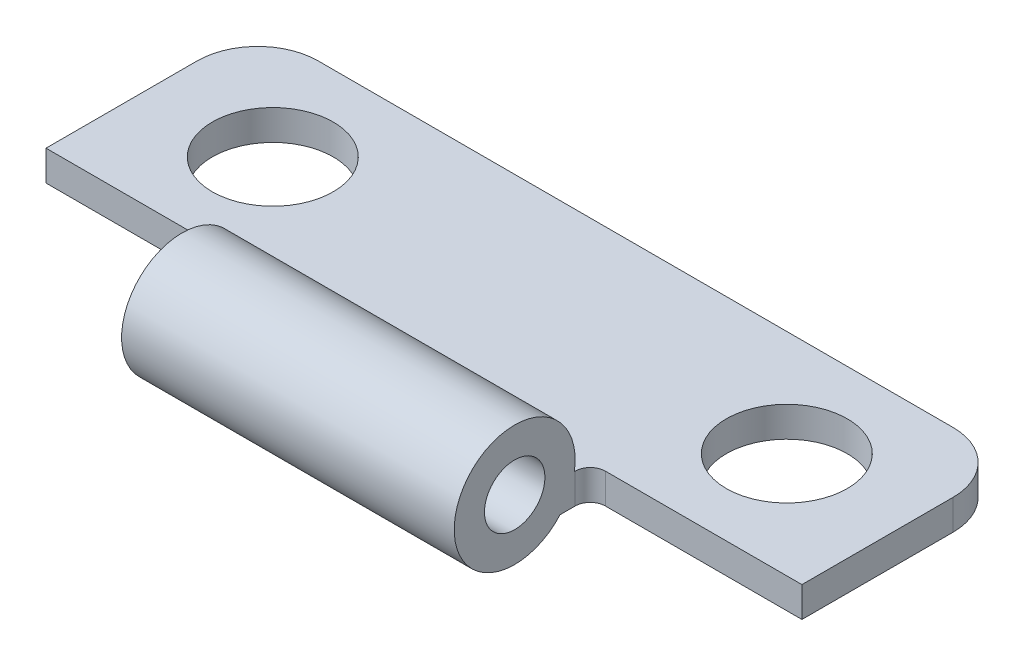
ISO-10303-21;
HEADER;
FILE_DESCRIPTION(('STEP AP214'),'2;1');
FILE_NAME('part.step','',(''),(''),'','','');
FILE_SCHEMA(('AUTOMOTIVE_DESIGN { 1 0 10303 214 1 1 1 1 }'));
ENDSEC;
DATA;
#1=APPLICATION_CONTEXT('core data for automotive mechanical design processes');
#2=APPLICATION_PROTOCOL_DEFINITION('international standard','automotive_design',2000,#1);
#3=PRODUCT_CONTEXT('',#1,'mechanical');
#4=PRODUCT('Part','Part','',(#3));
#5=PRODUCT_RELATED_PRODUCT_CATEGORY('part','',(#4));
#6=PRODUCT_DEFINITION_FORMATION('','',#4);
#7=PRODUCT_DEFINITION_CONTEXT('part definition',#1,'design');
#8=PRODUCT_DEFINITION('design','',#6,#7);
#9=PRODUCT_DEFINITION_SHAPE('','',#8);
#10=(LENGTH_UNIT() NAMED_UNIT(*) SI_UNIT(.MILLI.,.METRE.));
#11=(NAMED_UNIT(*) PLANE_ANGLE_UNIT() SI_UNIT($,.RADIAN.));
#12=(NAMED_UNIT(*) SI_UNIT($,.STERADIAN.) SOLID_ANGLE_UNIT());
#13=UNCERTAINTY_MEASURE_WITH_UNIT(LENGTH_MEASURE(1.E-05),#10,'distance_accuracy_value','');
#14=(GEOMETRIC_REPRESENTATION_CONTEXT(3) GLOBAL_UNCERTAINTY_ASSIGNED_CONTEXT((#13)) GLOBAL_UNIT_ASSIGNED_CONTEXT((#10,
#11,#12)) REPRESENTATION_CONTEXT('',''));
#15=CARTESIAN_POINT('',(0.,0.,0.));
#16=DIRECTION('',(0.,0.,1.));
#17=DIRECTION('',(1.,0.,0.));
#18=AXIS2_PLACEMENT_3D('',#15,#16,#17);
#19=CARTESIAN_POINT('',(0.,1.,0.));
#20=DIRECTION('',(0.,-1.,0.));
#21=DIRECTION('',(0.,0.,-1.));
#22=AXIS2_PLACEMENT_3D('',#19,#20,#21);
#23=PLANE('',#22);
#24=CARTESIAN_POINT('',(-8.5,1.,-4.5));
#25=DIRECTION('',(0.,1.,0.));
#26=DIRECTION('',(0.,0.,1.));
#27=AXIS2_PLACEMENT_3D('',#24,#25,#26);
#28=CIRCLE('',#27,2.);
#29=CARTESIAN_POINT('',(-8.5,1.,-2.5));
#30=VERTEX_POINT('',#29);
#31=EDGE_CURVE('E165',#30,#30,#28,.T.);
#32=ORIENTED_EDGE('',*,*,#31,.F.);
#33=EDGE_LOOP('',(#32));
#34=FACE_BOUND('',#33,.T.);
#35=CARTESIAN_POINT('',(8.5,1.,-4.5));
#36=DIRECTION('',(0.,1.,0.));
#37=DIRECTION('',(0.,0.,1.));
#38=AXIS2_PLACEMENT_3D('',#35,#36,#37);
#39=CIRCLE('',#38,2.);
#40=CARTESIAN_POINT('',(8.5,1.,-2.5));
#41=VERTEX_POINT('',#40);
#42=EDGE_CURVE('E171',#41,#41,#39,.T.);
#43=ORIENTED_EDGE('',*,*,#42,.F.);
#44=EDGE_LOOP('',(#43));
#45=FACE_BOUND('',#44,.T.);
#46=DIRECTION('',(-1.,0.,0.));
#47=VECTOR('',#46,1.);
#48=CARTESIAN_POINT('',(5.5,1.,-0.47376576904773));
#49=LINE('',#48,#47);
#50=CARTESIAN_POINT('',(5.5,1.,-0.47376576904773));
#51=VERTEX_POINT('',#50);
#52=CARTESIAN_POINT('',(-5.5,1.,-0.47376576904773));
#53=VERTEX_POINT('',#52);
#54=EDGE_CURVE('E61',#51,#53,#49,.T.);
#55=ORIENTED_EDGE('',*,*,#54,.F.);
#56=DIRECTION('',(0.,0.,-1.));
#57=VECTOR('',#56,1.);
#58=CARTESIAN_POINT('',(5.5,1.,0.));
#59=LINE('',#58,#57);
#60=CARTESIAN_POINT('',(5.5,1.,-0.499999999999997));
#61=VERTEX_POINT('',#60);
#62=EDGE_CURVE('E155',#51,#61,#59,.T.);
#63=ORIENTED_EDGE('',*,*,#62,.T.);
#64=CARTESIAN_POINT('',(6.,1.,-0.499999999999997));
#65=DIRECTION('',(0.,-1.,0.));
#66=DIRECTION('',(0.,0.,-1.));
#67=AXIS2_PLACEMENT_3D('',#64,#65,#66);
#68=CIRCLE('',#67,0.5);
#69=CARTESIAN_POINT('',(6.,1.,-0.999999999999997));
#70=VERTEX_POINT('',#69);
#71=EDGE_CURVE('E239',#61,#70,#68,.T.);
#72=ORIENTED_EDGE('',*,*,#71,.T.);
#73=DIRECTION('',(1.,0.,0.));
#74=VECTOR('',#73,1.);
#75=CARTESIAN_POINT('',(5.5,1.,-0.999999999999997));
#76=LINE('',#75,#74);
#77=CARTESIAN_POINT('',(12.5,1.,-0.999999999999996));
#78=VERTEX_POINT('',#77);
#79=EDGE_CURVE('E185',#70,#78,#76,.T.);
#80=ORIENTED_EDGE('',*,*,#79,.T.);
#81=DIRECTION('',(0.,0.,-1.));
#82=VECTOR('',#81,1.);
#83=CARTESIAN_POINT('',(12.5,1.,-8.));
#84=LINE('',#83,#82);
#85=CARTESIAN_POINT('',(12.5,1.,-6.));
#86=VERTEX_POINT('',#85);
#87=EDGE_CURVE('E187',#78,#86,#84,.T.);
#88=ORIENTED_EDGE('',*,*,#87,.T.);
#89=CARTESIAN_POINT('',(10.5,1.,-6.));
#90=DIRECTION('',(0.,-1.,0.));
#91=DIRECTION('',(0.,0.,-1.));
#92=AXIS2_PLACEMENT_3D('',#89,#90,#91);
#93=CIRCLE('',#92,2.);
#94=CARTESIAN_POINT('',(10.5,1.,-8.));
#95=VERTEX_POINT('',#94);
#96=EDGE_CURVE('E222',#86,#95,#93,.F.);
#97=ORIENTED_EDGE('',*,*,#96,.T.);
#98=DIRECTION('',(-1.,0.,0.));
#99=VECTOR('',#98,1.);
#100=CARTESIAN_POINT('',(-12.5,1.,-8.));
#101=LINE('',#100,#99);
#102=CARTESIAN_POINT('',(-10.5,1.,-8.));
#103=VERTEX_POINT('',#102);
#104=EDGE_CURVE('E190',#95,#103,#101,.T.);
#105=ORIENTED_EDGE('',*,*,#104,.T.);
#106=CARTESIAN_POINT('',(-10.5,1.,-6.));
#107=DIRECTION('',(0.,-1.,0.));
#108=DIRECTION('',(0.,0.,-1.));
#109=AXIS2_PLACEMENT_3D('',#106,#107,#108);
#110=CIRCLE('',#109,2.);
#111=CARTESIAN_POINT('',(-12.5,1.,-6.));
#112=VERTEX_POINT('',#111);
#113=EDGE_CURVE('E224',#103,#112,#110,.F.);
#114=ORIENTED_EDGE('',*,*,#113,.T.);
#115=DIRECTION('',(0.,0.,1.));
#116=VECTOR('',#115,1.);
#117=CARTESIAN_POINT('',(-12.5,1.,-0.999999999999996));
#118=LINE('',#117,#116);
#119=CARTESIAN_POINT('',(-12.5,1.,-0.999999999999996));
#120=VERTEX_POINT('',#119);
#121=EDGE_CURVE('E177',#112,#120,#118,.T.);
#122=ORIENTED_EDGE('',*,*,#121,.T.);
#123=DIRECTION('',(1.,0.,0.));
#124=VECTOR('',#123,1.);
#125=CARTESIAN_POINT('',(-12.5,1.,-0.999999999999996));
#126=LINE('',#125,#124);
#127=CARTESIAN_POINT('',(-6.,1.,-0.999999999999997));
#128=VERTEX_POINT('',#127);
#129=EDGE_CURVE('E179',#120,#128,#126,.T.);
#130=ORIENTED_EDGE('',*,*,#129,.T.);
#131=CARTESIAN_POINT('',(-6.,1.,-0.499999999999997));
#132=DIRECTION('',(0.,-1.,0.));
#133=DIRECTION('',(0.,0.,-1.));
#134=AXIS2_PLACEMENT_3D('',#131,#132,#133);
#135=CIRCLE('',#134,0.5);
#136=CARTESIAN_POINT('',(-5.5,1.,-0.499999999999997));
#137=VERTEX_POINT('',#136);
#138=EDGE_CURVE('E11',#128,#137,#135,.T.);
#139=ORIENTED_EDGE('',*,*,#138,.T.);
#140=DIRECTION('',(0.,0.,1.));
#141=VECTOR('',#140,1.);
#142=CARTESIAN_POINT('',(-5.5,1.,0.));
#143=LINE('',#142,#141);
#144=EDGE_CURVE('E57',#137,#53,#143,.T.);
#145=ORIENTED_EDGE('',*,*,#144,.T.);
#146=EDGE_LOOP('',(#55,#63,#72,#80,#88,#97,#105,#114,#122,#130,#139,#145));
#147=FACE_BOUND('',#146,.T.);
#148=ADVANCED_FACE('F43',(#34,#45,#147),#23,.F.);
#149=CARTESIAN_POINT('',(0.,0.,0.));
#150=DIRECTION('',(0.,-1.,0.));
#151=DIRECTION('',(0.,0.,-1.));
#152=AXIS2_PLACEMENT_3D('',#149,#150,#151);
#153=PLANE('',#152);
#154=CARTESIAN_POINT('',(8.5,0.,-4.5));
#155=DIRECTION('',(0.,1.,0.));
#156=DIRECTION('',(0.,0.,1.));
#157=AXIS2_PLACEMENT_3D('',#154,#155,#156);
#158=CIRCLE('',#157,2.);
#159=CARTESIAN_POINT('',(8.5,0.,-2.5));
#160=VERTEX_POINT('',#159);
#161=EDGE_CURVE('E168',#160,#160,#158,.T.);
#162=ORIENTED_EDGE('',*,*,#161,.T.);
#163=EDGE_LOOP('',(#162));
#164=FACE_BOUND('',#163,.T.);
#165=DIRECTION('',(0.,0.,1.));
#166=VECTOR('',#165,1.);
#167=CARTESIAN_POINT('',(-12.5,0.,-0.999999999999996));
#168=LINE('',#167,#166);
#169=CARTESIAN_POINT('',(-12.5,0.,-6.));
#170=VERTEX_POINT('',#169);
#171=CARTESIAN_POINT('',(-12.5,0.,-0.999999999999996));
#172=VERTEX_POINT('',#171);
#173=EDGE_CURVE('E174',#170,#172,#168,.T.);
#174=ORIENTED_EDGE('',*,*,#173,.F.);
#175=CARTESIAN_POINT('',(-10.5,0.,-6.));
#176=DIRECTION('',(0.,-1.,0.));
#177=DIRECTION('',(0.,0.,-1.));
#178=AXIS2_PLACEMENT_3D('',#175,#176,#177);
#179=CIRCLE('',#178,2.);
#180=CARTESIAN_POINT('',(-10.5,0.,-8.));
#181=VERTEX_POINT('',#180);
#182=EDGE_CURVE('E215',#170,#181,#179,.T.);
#183=ORIENTED_EDGE('',*,*,#182,.T.);
#184=DIRECTION('',(-1.,0.,0.));
#185=VECTOR('',#184,1.);
#186=CARTESIAN_POINT('',(-12.5,0.,-8.));
#187=LINE('',#186,#185);
#188=CARTESIAN_POINT('',(10.5,0.,-8.));
#189=VERTEX_POINT('',#188);
#190=EDGE_CURVE('E180',#189,#181,#187,.T.);
#191=ORIENTED_EDGE('',*,*,#190,.F.);
#192=CARTESIAN_POINT('',(10.5,0.,-6.));
#193=DIRECTION('',(0.,-1.,0.));
#194=DIRECTION('',(0.,0.,-1.));
#195=AXIS2_PLACEMENT_3D('',#192,#193,#194);
#196=CIRCLE('',#195,2.);
#197=CARTESIAN_POINT('',(12.5,0.,-6.));
#198=VERTEX_POINT('',#197);
#199=EDGE_CURVE('E213',#189,#198,#196,.T.);
#200=ORIENTED_EDGE('',*,*,#199,.T.);
#201=DIRECTION('',(0.,0.,-1.));
#202=VECTOR('',#201,1.);
#203=CARTESIAN_POINT('',(12.5,0.,-8.));
#204=LINE('',#203,#202);
#205=CARTESIAN_POINT('',(12.5,0.,-0.999999999999996));
#206=VERTEX_POINT('',#205);
#207=EDGE_CURVE('E200',#206,#198,#204,.T.);
#208=ORIENTED_EDGE('',*,*,#207,.F.);
#209=DIRECTION('',(1.,0.,0.));
#210=VECTOR('',#209,1.);
#211=CARTESIAN_POINT('',(5.5,0.,-0.999999999999997));
#212=LINE('',#211,#210);
#213=CARTESIAN_POINT('',(6.,0.,-0.999999999999997));
#214=VERTEX_POINT('',#213);
#215=EDGE_CURVE('E143',#214,#206,#212,.T.);
#216=ORIENTED_EDGE('',*,*,#215,.F.);
#217=CARTESIAN_POINT('',(6.,0.,-0.499999999999997));
#218=DIRECTION('',(0.,-1.,0.));
#219=DIRECTION('',(0.,0.,-1.));
#220=AXIS2_PLACEMENT_3D('',#217,#218,#219);
#221=CIRCLE('',#220,0.5);
#222=CARTESIAN_POINT('',(5.5,0.,-0.499999999999997));
#223=VERTEX_POINT('',#222);
#224=EDGE_CURVE('E138',#214,#223,#221,.F.);
#225=ORIENTED_EDGE('',*,*,#224,.T.);
#226=DIRECTION('',(0.,0.,-1.));
#227=VECTOR('',#226,1.);
#228=CARTESIAN_POINT('',(5.5,0.,0.));
#229=LINE('',#228,#227);
#230=CARTESIAN_POINT('',(5.5,0.,0.));
#231=VERTEX_POINT('',#230);
#232=EDGE_CURVE('E129',#231,#223,#229,.T.);
#233=ORIENTED_EDGE('',*,*,#232,.F.);
#234=DIRECTION('',(1.,0.,0.));
#235=VECTOR('',#234,1.);
#236=CARTESIAN_POINT('',(-5.5,0.,0.));
#237=LINE('',#236,#235);
#238=CARTESIAN_POINT('',(-5.5,0.,0.));
#239=VERTEX_POINT('',#238);
#240=EDGE_CURVE('E135',#239,#231,#237,.T.);
#241=ORIENTED_EDGE('',*,*,#240,.F.);
#242=DIRECTION('',(0.,0.,1.));
#243=VECTOR('',#242,1.);
#244=CARTESIAN_POINT('',(-5.5,0.,0.));
#245=LINE('',#244,#243);
#246=CARTESIAN_POINT('',(-5.5,0.,-0.499999999999997));
#247=VERTEX_POINT('',#246);
#248=EDGE_CURVE('E151',#247,#239,#245,.T.);
#249=ORIENTED_EDGE('',*,*,#248,.F.);
#250=CARTESIAN_POINT('',(-6.,0.,-0.499999999999997));
#251=DIRECTION('',(0.,-1.,0.));
#252=DIRECTION('',(0.,0.,-1.));
#253=AXIS2_PLACEMENT_3D('',#250,#251,#252);
#254=CIRCLE('',#253,0.5);
#255=CARTESIAN_POINT('',(-6.,0.,-0.999999999999997));
#256=VERTEX_POINT('',#255);
#257=EDGE_CURVE('E51',#247,#256,#254,.F.);
#258=ORIENTED_EDGE('',*,*,#257,.T.);
#259=DIRECTION('',(1.,0.,0.));
#260=VECTOR('',#259,1.);
#261=CARTESIAN_POINT('',(-12.5,0.,-0.999999999999996));
#262=LINE('',#261,#260);
#263=EDGE_CURVE('E195',#172,#256,#262,.T.);
#264=ORIENTED_EDGE('',*,*,#263,.F.);
#265=EDGE_LOOP('',(#174,#183,#191,#200,#208,#216,#225,#233,#241,#249,#258,#264));
#266=FACE_BOUND('',#265,.T.);
#267=CARTESIAN_POINT('',(-8.5,0.,-4.5));
#268=DIRECTION('',(0.,1.,0.));
#269=DIRECTION('',(0.,0.,1.));
#270=AXIS2_PLACEMENT_3D('',#267,#268,#269);
#271=CIRCLE('',#270,2.);
#272=CARTESIAN_POINT('',(-8.5,0.,-2.5));
#273=VERTEX_POINT('',#272);
#274=EDGE_CURVE('E157',#273,#273,#271,.T.);
#275=ORIENTED_EDGE('',*,*,#274,.T.);
#276=EDGE_LOOP('',(#275));
#277=FACE_BOUND('',#276,.T.);
#278=ADVANCED_FACE('F132',(#164,#266,#277),#153,.T.);
#279=CARTESIAN_POINT('',(-12.5,1.,-0.999999999999996));
#280=DIRECTION('',(1.,0.,0.));
#281=DIRECTION('',(0.,0.,-1.));
#282=AXIS2_PLACEMENT_3D('',#279,#280,#281);
#283=PLANE('',#282);
#284=ORIENTED_EDGE('',*,*,#121,.F.);
#285=DIRECTION('',(0.,-1.,0.));
#286=VECTOR('',#285,1.);
#287=CARTESIAN_POINT('',(-12.5,1.,-6.));
#288=LINE('',#287,#286);
#289=EDGE_CURVE('E210',#112,#170,#288,.T.);
#290=ORIENTED_EDGE('',*,*,#289,.T.);
#291=ORIENTED_EDGE('',*,*,#173,.T.);
#292=DIRECTION('',(0.,-1.,0.));
#293=VECTOR('',#292,1.);
#294=CARTESIAN_POINT('',(-12.5,1.,-0.999999999999996));
#295=LINE('',#294,#293);
#296=EDGE_CURVE('E207',#120,#172,#295,.T.);
#297=ORIENTED_EDGE('',*,*,#296,.F.);
#298=EDGE_LOOP('',(#284,#290,#291,#297));
#299=FACE_BOUND('',#298,.T.);
#300=ADVANCED_FACE('F278',(#299),#283,.F.);
#301=CARTESIAN_POINT('',(-12.5,1.,-0.999999999999996));
#302=DIRECTION('',(0.,0.,-1.));
#303=DIRECTION('',(-1.,0.,0.));
#304=AXIS2_PLACEMENT_3D('',#301,#302,#303);
#305=PLANE('',#304);
#306=ORIENTED_EDGE('',*,*,#263,.T.);
#307=DIRECTION('',(0.,-1.,0.));
#308=VECTOR('',#307,1.);
#309=CARTESIAN_POINT('',(-6.,1.,-0.999999999999997));
#310=LINE('',#309,#308);
#311=EDGE_CURVE('E236',#256,#128,#310,.F.);
#312=ORIENTED_EDGE('',*,*,#311,.T.);
#313=ORIENTED_EDGE('',*,*,#129,.F.);
#314=ORIENTED_EDGE('',*,*,#296,.T.);
#315=EDGE_LOOP('',(#306,#312,#313,#314));
#316=FACE_BOUND('',#315,.T.);
#317=ADVANCED_FACE('F245',(#316),#305,.F.);
#318=CARTESIAN_POINT('',(-5.5,1.,0.));
#319=DIRECTION('',(1.,0.,0.));
#320=DIRECTION('',(0.,0.,-1.));
#321=AXIS2_PLACEMENT_3D('',#318,#319,#320);
#322=PLANE('',#321);
#323=ORIENTED_EDGE('',*,*,#248,.T.);
#324=CARTESIAN_POINT('',(-5.5,1.32287565553229,1.5));
#325=DIRECTION('',(1.,0.,0.));
#326=DIRECTION('',(0.,0.,-1.));
#327=AXIS2_PLACEMENT_3D('',#324,#325,#326);
#328=CIRCLE('',#327,2.);
#329=EDGE_CURVE('E150',#53,#239,#328,.T.);
#330=ORIENTED_EDGE('',*,*,#329,.F.);
#331=ORIENTED_EDGE('',*,*,#144,.F.);
#332=DIRECTION('',(0.,-1.,0.));
#333=VECTOR('',#332,1.);
#334=CARTESIAN_POINT('',(-5.5,0.,-0.499999999999997));
#335=LINE('',#334,#333);
#336=EDGE_CURVE('E233',#137,#247,#335,.T.);
#337=ORIENTED_EDGE('',*,*,#336,.T.);
#338=EDGE_LOOP('',(#323,#330,#331,#337));
#339=FACE_BOUND('',#338,.T.);
#340=CARTESIAN_POINT('',(-5.5,1.32287565553229,1.5));
#341=DIRECTION('',(1.,0.,0.));
#342=DIRECTION('',(0.,0.,-1.));
#343=AXIS2_PLACEMENT_3D('',#340,#341,#342);
#344=CIRCLE('',#343,1.);
#345=CARTESIAN_POINT('',(-5.5,1.32287565553229,0.500000000000004));
#346=VERTEX_POINT('',#345);
#347=EDGE_CURVE('E162',#346,#346,#344,.T.);
#348=ORIENTED_EDGE('',*,*,#347,.T.);
#349=EDGE_LOOP('',(#348));
#350=FACE_BOUND('',#349,.T.);
#351=ADVANCED_FACE('F250',(#339,#350),#322,.F.);
#352=CARTESIAN_POINT('',(5.5,1.,0.));
#353=DIRECTION('',(-1.,0.,0.));
#354=DIRECTION('',(0.,0.,1.));
#355=AXIS2_PLACEMENT_3D('',#352,#353,#354);
#356=PLANE('',#355);
#357=ORIENTED_EDGE('',*,*,#62,.F.);
#358=CARTESIAN_POINT('',(5.5,1.32287565553229,1.5));
#359=DIRECTION('',(1.,0.,0.));
#360=DIRECTION('',(0.,0.,-1.));
#361=AXIS2_PLACEMENT_3D('',#358,#359,#360);
#362=CIRCLE('',#361,2.);
#363=EDGE_CURVE('E148',#51,#231,#362,.T.);
#364=ORIENTED_EDGE('',*,*,#363,.T.);
#365=ORIENTED_EDGE('',*,*,#232,.T.);
#366=DIRECTION('',(0.,-1.,0.));
#367=VECTOR('',#366,1.);
#368=CARTESIAN_POINT('',(5.5,1.,-0.499999999999997));
#369=LINE('',#368,#367);
#370=EDGE_CURVE('E231',#223,#61,#369,.F.);
#371=ORIENTED_EDGE('',*,*,#370,.T.);
#372=EDGE_LOOP('',(#357,#364,#365,#371));
#373=FACE_BOUND('',#372,.T.);
#374=CARTESIAN_POINT('',(5.5,1.32287565553229,1.5));
#375=DIRECTION('',(1.,0.,0.));
#376=DIRECTION('',(0.,0.,-1.));
#377=AXIS2_PLACEMENT_3D('',#374,#375,#376);
#378=CIRCLE('',#377,1.);
#379=CARTESIAN_POINT('',(5.5,1.32287565553229,0.500000000000004));
#380=VERTEX_POINT('',#379);
#381=EDGE_CURVE('E159',#380,#380,#378,.T.);
#382=ORIENTED_EDGE('',*,*,#381,.F.);
#383=EDGE_LOOP('',(#382));
#384=FACE_BOUND('',#383,.T.);
#385=ADVANCED_FACE('F153',(#373,#384),#356,.F.);
#386=CARTESIAN_POINT('',(5.5,1.,-0.999999999999997));
#387=DIRECTION('',(0.,0.,-1.));
#388=DIRECTION('',(-1.,0.,0.));
#389=AXIS2_PLACEMENT_3D('',#386,#387,#388);
#390=PLANE('',#389);
#391=ORIENTED_EDGE('',*,*,#79,.F.);
#392=DIRECTION('',(0.,-1.,0.));
#393=VECTOR('',#392,1.);
#394=CARTESIAN_POINT('',(6.,0.,-0.999999999999997));
#395=LINE('',#394,#393);
#396=EDGE_CURVE('E228',#70,#214,#395,.T.);
#397=ORIENTED_EDGE('',*,*,#396,.T.);
#398=ORIENTED_EDGE('',*,*,#215,.T.);
#399=DIRECTION('',(0.,-1.,0.));
#400=VECTOR('',#399,1.);
#401=CARTESIAN_POINT('',(12.5,1.,-0.999999999999996));
#402=LINE('',#401,#400);
#403=EDGE_CURVE('E193',#78,#206,#402,.T.);
#404=ORIENTED_EDGE('',*,*,#403,.F.);
#405=EDGE_LOOP('',(#391,#397,#398,#404));
#406=FACE_BOUND('',#405,.T.);
#407=ADVANCED_FACE('F262',(#406),#390,.F.);
#408=CARTESIAN_POINT('',(12.5,1.,-8.));
#409=DIRECTION('',(-1.,0.,0.));
#410=DIRECTION('',(0.,0.,1.));
#411=AXIS2_PLACEMENT_3D('',#408,#409,#410);
#412=PLANE('',#411);
#413=ORIENTED_EDGE('',*,*,#207,.T.);
#414=DIRECTION('',(0.,-1.,0.));
#415=VECTOR('',#414,1.);
#416=CARTESIAN_POINT('',(12.5,1.,-6.));
#417=LINE('',#416,#415);
#418=EDGE_CURVE('E226',#198,#86,#417,.F.);
#419=ORIENTED_EDGE('',*,*,#418,.T.);
#420=ORIENTED_EDGE('',*,*,#87,.F.);
#421=ORIENTED_EDGE('',*,*,#403,.T.);
#422=EDGE_LOOP('',(#413,#419,#420,#421));
#423=FACE_BOUND('',#422,.T.);
#424=ADVANCED_FACE('F268',(#423),#412,.F.);
#425=CARTESIAN_POINT('',(-12.5,1.,-8.));
#426=DIRECTION('',(0.,0.,1.));
#427=DIRECTION('',(1.,0.,0.));
#428=AXIS2_PLACEMENT_3D('',#425,#426,#427);
#429=PLANE('',#428);
#430=ORIENTED_EDGE('',*,*,#190,.T.);
#431=DIRECTION('',(0.,-1.,0.));
#432=VECTOR('',#431,1.);
#433=CARTESIAN_POINT('',(-10.5,1.,-8.));
#434=LINE('',#433,#432);
#435=EDGE_CURVE('E220',#181,#103,#434,.F.);
#436=ORIENTED_EDGE('',*,*,#435,.T.);
#437=ORIENTED_EDGE('',*,*,#104,.F.);
#438=DIRECTION('',(0.,-1.,0.));
#439=VECTOR('',#438,1.);
#440=CARTESIAN_POINT('',(10.5,1.,-8.));
#441=LINE('',#440,#439);
#442=EDGE_CURVE('E217',#95,#189,#441,.T.);
#443=ORIENTED_EDGE('',*,*,#442,.T.);
#444=EDGE_LOOP('',(#430,#436,#437,#443));
#445=FACE_BOUND('',#444,.T.);
#446=ADVANCED_FACE('F287',(#445),#429,.F.);
#447=CARTESIAN_POINT('',(8.5,1.,-4.5));
#448=DIRECTION('',(0.,-1.,0.));
#449=DIRECTION('',(0.,0.,-1.));
#450=AXIS2_PLACEMENT_3D('',#447,#448,#449);
#451=CYLINDRICAL_SURFACE('',#450,2.);
#452=ORIENTED_EDGE('',*,*,#42,.T.);
#453=EDGE_LOOP('',(#452));
#454=FACE_BOUND('',#453,.T.);
#455=ORIENTED_EDGE('',*,*,#161,.F.);
#456=EDGE_LOOP('',(#455));
#457=FACE_BOUND('',#456,.T.);
#458=ADVANCED_FACE('F284',(#454,#457),#451,.F.);
#459=CARTESIAN_POINT('',(-8.5,1.,-4.5));
#460=DIRECTION('',(0.,-1.,0.));
#461=DIRECTION('',(0.,0.,-1.));
#462=AXIS2_PLACEMENT_3D('',#459,#460,#461);
#463=CYLINDRICAL_SURFACE('',#462,2.);
#464=ORIENTED_EDGE('',*,*,#31,.T.);
#465=EDGE_LOOP('',(#464));
#466=FACE_BOUND('',#465,.T.);
#467=ORIENTED_EDGE('',*,*,#274,.F.);
#468=EDGE_LOOP('',(#467));
#469=FACE_BOUND('',#468,.T.);
#470=ADVANCED_FACE('F322',(#466,#469),#463,.F.);
#471=CARTESIAN_POINT('',(-10.5,1.,-6.));
#472=DIRECTION('',(0.,-1.,0.));
#473=DIRECTION('',(0.,0.,-1.));
#474=AXIS2_PLACEMENT_3D('',#471,#472,#473);
#475=CYLINDRICAL_SURFACE('',#474,2.);
#476=ORIENTED_EDGE('',*,*,#113,.F.);
#477=ORIENTED_EDGE('',*,*,#435,.F.);
#478=ORIENTED_EDGE('',*,*,#182,.F.);
#479=ORIENTED_EDGE('',*,*,#289,.F.);
#480=EDGE_LOOP('',(#476,#477,#478,#479));
#481=FACE_BOUND('',#480,.T.);
#482=ADVANCED_FACE('F309',(#481),#475,.T.);
#483=CARTESIAN_POINT('',(10.5,1.,-6.));
#484=DIRECTION('',(0.,-1.,0.));
#485=DIRECTION('',(0.,0.,-1.));
#486=AXIS2_PLACEMENT_3D('',#483,#484,#485);
#487=CYLINDRICAL_SURFACE('',#486,2.);
#488=ORIENTED_EDGE('',*,*,#96,.F.);
#489=ORIENTED_EDGE('',*,*,#418,.F.);
#490=ORIENTED_EDGE('',*,*,#199,.F.);
#491=ORIENTED_EDGE('',*,*,#442,.F.);
#492=EDGE_LOOP('',(#488,#489,#490,#491));
#493=FACE_BOUND('',#492,.T.);
#494=ADVANCED_FACE('F302',(#493),#487,.T.);
#495=CARTESIAN_POINT('',(6.,1.,-0.499999999999997));
#496=DIRECTION('',(0.,1.,0.));
#497=DIRECTION('',(0.,0.,1.));
#498=AXIS2_PLACEMENT_3D('',#495,#496,#497);
#499=CYLINDRICAL_SURFACE('',#498,0.5);
#500=ORIENTED_EDGE('',*,*,#71,.F.);
#501=ORIENTED_EDGE('',*,*,#370,.F.);
#502=ORIENTED_EDGE('',*,*,#224,.F.);
#503=ORIENTED_EDGE('',*,*,#396,.F.);
#504=EDGE_LOOP('',(#500,#501,#502,#503));
#505=FACE_BOUND('',#504,.T.);
#506=ADVANCED_FACE('F324',(#505),#499,.F.);
#507=CARTESIAN_POINT('',(-6.,1.,-0.499999999999997));
#508=DIRECTION('',(0.,1.,0.));
#509=DIRECTION('',(0.,0.,1.));
#510=AXIS2_PLACEMENT_3D('',#507,#508,#509);
#511=CYLINDRICAL_SURFACE('',#510,0.5);
#512=ORIENTED_EDGE('',*,*,#138,.F.);
#513=ORIENTED_EDGE('',*,*,#311,.F.);
#514=ORIENTED_EDGE('',*,*,#257,.F.);
#515=ORIENTED_EDGE('',*,*,#336,.F.);
#516=EDGE_LOOP('',(#512,#513,#514,#515));
#517=FACE_BOUND('',#516,.T.);
#518=ADVANCED_FACE('F45',(#517),#511,.F.);
#519=CARTESIAN_POINT('',(5.5,1.32287565553229,1.5));
#520=DIRECTION('',(-1.,0.,0.));
#521=DIRECTION('',(0.,0.,1.));
#522=AXIS2_PLACEMENT_3D('',#519,#520,#521);
#523=CYLINDRICAL_SURFACE('',#522,2.);
#524=ORIENTED_EDGE('',*,*,#363,.F.);
#525=ORIENTED_EDGE('',*,*,#54,.T.);
#526=ORIENTED_EDGE('',*,*,#329,.T.);
#527=ORIENTED_EDGE('',*,*,#240,.T.);
#528=EDGE_LOOP('',(#524,#525,#526,#527));
#529=FACE_BOUND('',#528,.T.);
#530=ADVANCED_FACE('F147',(#529),#523,.T.);
#531=CARTESIAN_POINT('',(5.5,1.32287565553229,1.5));
#532=DIRECTION('',(-1.,0.,0.));
#533=DIRECTION('',(0.,0.,1.));
#534=AXIS2_PLACEMENT_3D('',#531,#532,#533);
#535=CYLINDRICAL_SURFACE('',#534,1.);
#536=ORIENTED_EDGE('',*,*,#381,.T.);
#537=EDGE_LOOP('',(#536));
#538=FACE_BOUND('',#537,.T.);
#539=ORIENTED_EDGE('',*,*,#347,.F.);
#540=EDGE_LOOP('',(#539));
#541=FACE_BOUND('',#540,.T.);
#542=ADVANCED_FACE('F260',(#538,#541),#535,.F.);
#543=CLOSED_SHELL('',(#148,#278,#300,#317,#351,#385,#407,#424,#446,#458,#470,#482,#494,#506,
#518,#530,#542));
#544=MANIFOLD_SOLID_BREP('B2',#543);
#545=ADVANCED_BREP_SHAPE_REPRESENTATION('',(#18,#544),#14);
#546=SHAPE_DEFINITION_REPRESENTATION(#9,#545);
ENDSEC;
END-ISO-10303-21;
